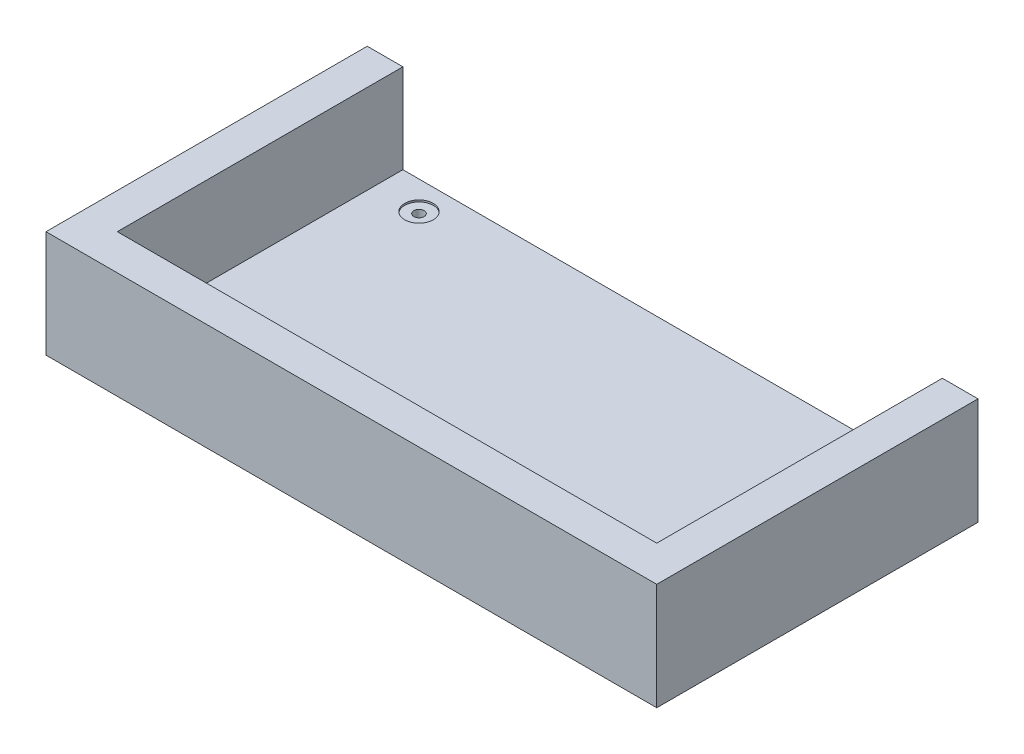
ISO-10303-21;
HEADER;
FILE_DESCRIPTION(('STEP AP214'),'2;1');
FILE_NAME('part.step','',(''),(''),'','','');
FILE_SCHEMA(('AUTOMOTIVE_DESIGN { 1 0 10303 214 1 1 1 1 }'));
ENDSEC;
DATA;
#1=APPLICATION_CONTEXT('core data for automotive mechanical design processes');
#2=APPLICATION_PROTOCOL_DEFINITION('international standard','automotive_design',2000,#1);
#3=PRODUCT_CONTEXT('',#1,'mechanical');
#4=PRODUCT('Part','Part','',(#3));
#5=PRODUCT_RELATED_PRODUCT_CATEGORY('part','',(#4));
#6=PRODUCT_DEFINITION_FORMATION('','',#4);
#7=PRODUCT_DEFINITION_CONTEXT('part definition',#1,'design');
#8=PRODUCT_DEFINITION('design','',#6,#7);
#9=PRODUCT_DEFINITION_SHAPE('','',#8);
#10=(LENGTH_UNIT() NAMED_UNIT(*) SI_UNIT(.MILLI.,.METRE.));
#11=(NAMED_UNIT(*) PLANE_ANGLE_UNIT() SI_UNIT($,.RADIAN.));
#12=(NAMED_UNIT(*) SI_UNIT($,.STERADIAN.) SOLID_ANGLE_UNIT());
#13=UNCERTAINTY_MEASURE_WITH_UNIT(LENGTH_MEASURE(1.E-05),#10,'distance_accuracy_value','');
#14=(GEOMETRIC_REPRESENTATION_CONTEXT(3) GLOBAL_UNCERTAINTY_ASSIGNED_CONTEXT((#13)) GLOBAL_UNIT_ASSIGNED_CONTEXT((#10,
#11,#12)) REPRESENTATION_CONTEXT('',''));
#15=CARTESIAN_POINT('',(0.,0.,0.));
#16=DIRECTION('',(0.,0.,1.));
#17=DIRECTION('',(1.,0.,0.));
#18=AXIS2_PLACEMENT_3D('',#15,#16,#17);
#19=CARTESIAN_POINT('',(-53.6717133956386,5.,-53.3701869158878));
#20=DIRECTION('',(0.,0.,1.));
#21=DIRECTION('',(1.,0.,0.));
#22=AXIS2_PLACEMENT_3D('',#19,#20,#21);
#23=PLANE('',#22);
#24=DIRECTION('',(-1.,0.,0.));
#25=VECTOR('',#24,1.);
#26=CARTESIAN_POINT('',(-53.6717133956386,0.,-53.3701869158878));
#27=LINE('',#26,#25);
#28=CARTESIAN_POINT('',(107.658286604361,0.,-53.3701869158878));
#29=VERTEX_POINT('',#28);
#30=CARTESIAN_POINT('',(-63.6717133956386,0.,-53.3701869158878));
#31=VERTEX_POINT('',#30);
#32=EDGE_CURVE('E120',#29,#31,#27,.T.);
#33=ORIENTED_EDGE('',*,*,#32,.T.);
#34=DIRECTION('',(0.,-1.,0.));
#35=VECTOR('',#34,1.);
#36=CARTESIAN_POINT('',(-63.6717133956386,30.,-53.3701869158878));
#37=LINE('',#36,#35);
#38=CARTESIAN_POINT('',(-63.6717133956386,30.,-53.3701869158878));
#39=VERTEX_POINT('',#38);
#40=EDGE_CURVE('E101',#39,#31,#37,.T.);
#41=ORIENTED_EDGE('',*,*,#40,.F.);
#42=DIRECTION('',(-1.,0.,0.));
#43=VECTOR('',#42,1.);
#44=CARTESIAN_POINT('',(0.,30.,-53.3701869158878));
#45=LINE('',#44,#43);
#46=CARTESIAN_POINT('',(-53.6717133956386,30.,-53.3701869158878));
#47=VERTEX_POINT('',#46);
#48=EDGE_CURVE('E107',#47,#39,#45,.T.);
#49=ORIENTED_EDGE('',*,*,#48,.F.);
#50=DIRECTION('',(0.,-1.,0.));
#51=VECTOR('',#50,1.);
#52=CARTESIAN_POINT('',(-53.6717133956386,30.,-53.3701869158878));
#53=LINE('',#52,#51);
#54=CARTESIAN_POINT('',(-53.6717133956386,5.,-53.3701869158878));
#55=VERTEX_POINT('',#54);
#56=EDGE_CURVE('E185',#47,#55,#53,.T.);
#57=ORIENTED_EDGE('',*,*,#56,.T.);
#58=DIRECTION('',(-1.,0.,0.));
#59=VECTOR('',#58,1.);
#60=CARTESIAN_POINT('',(-53.6717133956386,5.,-53.3701869158878));
#61=LINE('',#60,#59);
#62=CARTESIAN_POINT('',(97.6582866043614,5.,-53.3701869158878));
#63=VERTEX_POINT('',#62);
#64=EDGE_CURVE('E11',#63,#55,#61,.T.);
#65=ORIENTED_EDGE('',*,*,#64,.F.);
#66=DIRECTION('',(0.,-1.,0.));
#67=VECTOR('',#66,1.);
#68=CARTESIAN_POINT('',(97.6582866043614,30.,-53.3701869158878));
#69=LINE('',#68,#67);
#70=CARTESIAN_POINT('',(97.6582866043614,30.,-53.3701869158878));
#71=VERTEX_POINT('',#70);
#72=EDGE_CURVE('E199',#71,#63,#69,.T.);
#73=ORIENTED_EDGE('',*,*,#72,.F.);
#74=DIRECTION('',(1.,0.,0.));
#75=VECTOR('',#74,1.);
#76=CARTESIAN_POINT('',(0.,30.,-53.3701869158878));
#77=LINE('',#76,#75);
#78=CARTESIAN_POINT('',(107.658286604361,30.,-53.3701869158878));
#79=VERTEX_POINT('',#78);
#80=EDGE_CURVE('E176',#71,#79,#77,.T.);
#81=ORIENTED_EDGE('',*,*,#80,.T.);
#82=DIRECTION('',(0.,-1.,0.));
#83=VECTOR('',#82,1.);
#84=CARTESIAN_POINT('',(107.658286604361,30.,-53.3701869158878));
#85=LINE('',#84,#83);
#86=EDGE_CURVE('E202',#79,#29,#85,.T.);
#87=ORIENTED_EDGE('',*,*,#86,.T.);
#88=EDGE_LOOP('',(#33,#41,#49,#57,#65,#73,#81,#87));
#89=FACE_BOUND('',#88,.T.);
#90=ADVANCED_FACE('F35',(#89),#23,.F.);
#91=CARTESIAN_POINT('',(0.,5.,0.));
#92=DIRECTION('',(0.,1.,0.));
#93=DIRECTION('',(0.,0.,1.));
#94=AXIS2_PLACEMENT_3D('',#91,#92,#93);
#95=PLANE('',#94);
#96=CARTESIAN_POINT('',(85.7004089556943,5.,16.2566118993325));
#97=DIRECTION('',(0.,1.,0.));
#98=DIRECTION('',(0.,0.,1.));
#99=AXIS2_PLACEMENT_3D('',#96,#97,#98);
#100=CIRCLE('',#99,4.);
#101=CARTESIAN_POINT('',(85.7004089556943,5.,20.2566118993325));
#102=VERTEX_POINT('',#101);
#103=EDGE_CURVE('E301',#102,#102,#100,.T.);
#104=ORIENTED_EDGE('',*,*,#103,.F.);
#105=EDGE_LOOP('',(#104));
#106=FACE_BOUND('',#105,.T.);
#107=CARTESIAN_POINT('',(-41.247040950059,5.,16.3367924297844));
#108=DIRECTION('',(0.,1.,0.));
#109=DIRECTION('',(0.,0.,1.));
#110=AXIS2_PLACEMENT_3D('',#107,#108,#109);
#111=CIRCLE('',#110,4.);
#112=CARTESIAN_POINT('',(-41.247040950059,5.,20.3367924297844));
#113=VERTEX_POINT('',#112);
#114=EDGE_CURVE('E157',#113,#113,#111,.T.);
#115=ORIENTED_EDGE('',*,*,#114,.F.);
#116=EDGE_LOOP('',(#115));
#117=FACE_BOUND('',#116,.T.);
#118=CARTESIAN_POINT('',(-41.247040950059,5.,-45.4632364629279));
#119=DIRECTION('',(0.,1.,0.));
#120=DIRECTION('',(0.,0.,1.));
#121=AXIS2_PLACEMENT_3D('',#118,#119,#120);
#122=CIRCLE('',#121,4.);
#123=CARTESIAN_POINT('',(-41.247040950059,5.,-41.4632364629279));
#124=VERTEX_POINT('',#123);
#125=EDGE_CURVE('E144',#124,#124,#122,.T.);
#126=ORIENTED_EDGE('',*,*,#125,.F.);
#127=EDGE_LOOP('',(#126));
#128=FACE_BOUND('',#127,.T.);
#129=CARTESIAN_POINT('',(86.0699895869456,5.,-45.4632364629279));
#130=DIRECTION('',(0.,1.,0.));
#131=DIRECTION('',(0.,0.,1.));
#132=AXIS2_PLACEMENT_3D('',#129,#130,#131);
#133=CIRCLE('',#132,4.);
#134=CARTESIAN_POINT('',(86.0699895869456,5.,-41.4632364629279));
#135=VERTEX_POINT('',#134);
#136=EDGE_CURVE('E140',#135,#135,#133,.T.);
#137=ORIENTED_EDGE('',*,*,#136,.F.);
#138=EDGE_LOOP('',(#137));
#139=FACE_BOUND('',#138,.T.);
#140=DIRECTION('',(0.,0.,1.));
#141=VECTOR('',#140,1.);
#142=CARTESIAN_POINT('',(-53.6717133956386,5.,-53.3701869158878));
#143=LINE('',#142,#141);
#144=CARTESIAN_POINT('',(-53.6717133956386,5.,26.7498130841122));
#145=VERTEX_POINT('',#144);
#146=EDGE_CURVE('E123',#55,#145,#143,.T.);
#147=ORIENTED_EDGE('',*,*,#146,.T.);
#148=DIRECTION('',(1.,0.,0.));
#149=VECTOR('',#148,1.);
#150=CARTESIAN_POINT('',(-53.6717133956386,5.,26.7498130841122));
#151=LINE('',#150,#149);
#152=CARTESIAN_POINT('',(97.6582866043614,5.,26.7498130841122));
#153=VERTEX_POINT('',#152);
#154=EDGE_CURVE('E130',#145,#153,#151,.T.);
#155=ORIENTED_EDGE('',*,*,#154,.T.);
#156=DIRECTION('',(0.,0.,-1.));
#157=VECTOR('',#156,1.);
#158=CARTESIAN_POINT('',(97.6582866043614,5.,-53.3701869158878));
#159=LINE('',#158,#157);
#160=EDGE_CURVE('E43',#153,#63,#159,.T.);
#161=ORIENTED_EDGE('',*,*,#160,.T.);
#162=ORIENTED_EDGE('',*,*,#64,.T.);
#163=EDGE_LOOP('',(#147,#155,#161,#162));
#164=FACE_BOUND('',#163,.T.);
#165=ADVANCED_FACE('F222',(#106,#117,#128,#139,#164),#95,.T.);
#166=CARTESIAN_POINT('',(0.,0.,0.));
#167=DIRECTION('',(0.,1.,0.));
#168=DIRECTION('',(0.,0.,1.));
#169=AXIS2_PLACEMENT_3D('',#166,#167,#168);
#170=PLANE('',#169);
#171=CARTESIAN_POINT('',(85.7004089556943,0.,16.2566118993325));
#172=DIRECTION('',(0.,1.,0.));
#173=DIRECTION('',(0.,0.,1.));
#174=AXIS2_PLACEMENT_3D('',#171,#172,#173);
#175=CIRCLE('',#174,1.44999999999999);
#176=CARTESIAN_POINT('',(85.7004089556943,0.,17.7066118993325));
#177=VERTEX_POINT('',#176);
#178=EDGE_CURVE('E38',#177,#177,#175,.T.);
#179=ORIENTED_EDGE('',*,*,#178,.T.);
#180=EDGE_LOOP('',(#179));
#181=FACE_BOUND('',#180,.T.);
#182=CARTESIAN_POINT('',(-41.247040950059,0.,16.3367924297844));
#183=DIRECTION('',(0.,1.,0.));
#184=DIRECTION('',(0.,0.,1.));
#185=AXIS2_PLACEMENT_3D('',#182,#183,#184);
#186=CIRCLE('',#185,1.45);
#187=CARTESIAN_POINT('',(-41.247040950059,0.,17.7867924297844));
#188=VERTEX_POINT('',#187);
#189=EDGE_CURVE('E142',#188,#188,#186,.T.);
#190=ORIENTED_EDGE('',*,*,#189,.T.);
#191=EDGE_LOOP('',(#190));
#192=FACE_BOUND('',#191,.T.);
#193=CARTESIAN_POINT('',(-41.247040950059,0.,-45.4632364629279));
#194=DIRECTION('',(0.,1.,0.));
#195=DIRECTION('',(0.,0.,1.));
#196=AXIS2_PLACEMENT_3D('',#193,#194,#195);
#197=CIRCLE('',#196,1.45);
#198=CARTESIAN_POINT('',(-41.247040950059,0.,-44.0132364629279));
#199=VERTEX_POINT('',#198);
#200=EDGE_CURVE('E138',#199,#199,#197,.T.);
#201=ORIENTED_EDGE('',*,*,#200,.T.);
#202=EDGE_LOOP('',(#201));
#203=FACE_BOUND('',#202,.T.);
#204=CARTESIAN_POINT('',(86.0699895869456,0.,-45.4632364629279));
#205=DIRECTION('',(0.,1.,0.));
#206=DIRECTION('',(0.,0.,1.));
#207=AXIS2_PLACEMENT_3D('',#204,#205,#206);
#208=CIRCLE('',#207,1.44999999999999);
#209=CARTESIAN_POINT('',(86.0699895869456,0.,-44.0132364629279));
#210=VERTEX_POINT('',#209);
#211=EDGE_CURVE('E133',#210,#210,#208,.T.);
#212=ORIENTED_EDGE('',*,*,#211,.T.);
#213=EDGE_LOOP('',(#212));
#214=FACE_BOUND('',#213,.T.);
#215=ORIENTED_EDGE('',*,*,#32,.F.);
#216=DIRECTION('',(0.,0.,1.));
#217=VECTOR('',#216,1.);
#218=CARTESIAN_POINT('',(107.658286604361,0.,0.));
#219=LINE('',#218,#217);
#220=CARTESIAN_POINT('',(107.658286604361,0.,36.7498130841122));
#221=VERTEX_POINT('',#220);
#222=EDGE_CURVE('E117',#29,#221,#219,.T.);
#223=ORIENTED_EDGE('',*,*,#222,.T.);
#224=DIRECTION('',(-1.,0.,0.));
#225=VECTOR('',#224,1.);
#226=CARTESIAN_POINT('',(0.,0.,36.7498130841122));
#227=LINE('',#226,#225);
#228=CARTESIAN_POINT('',(-63.6717133956386,0.,36.7498130841122));
#229=VERTEX_POINT('',#228);
#230=EDGE_CURVE('E187',#221,#229,#227,.T.);
#231=ORIENTED_EDGE('',*,*,#230,.T.);
#232=DIRECTION('',(0.,0.,1.));
#233=VECTOR('',#232,1.);
#234=CARTESIAN_POINT('',(-63.6717133956386,0.,0.));
#235=LINE('',#234,#233);
#236=EDGE_CURVE('E136',#31,#229,#235,.T.);
#237=ORIENTED_EDGE('',*,*,#236,.F.);
#238=EDGE_LOOP('',(#215,#223,#231,#237));
#239=FACE_BOUND('',#238,.T.);
#240=ADVANCED_FACE('F211',(#181,#192,#203,#214,#239),#170,.F.);
#241=CARTESIAN_POINT('',(-63.6717133956386,30.,0.));
#242=DIRECTION('',(1.,0.,0.));
#243=DIRECTION('',(0.,0.,-1.));
#244=AXIS2_PLACEMENT_3D('',#241,#242,#243);
#245=PLANE('',#244);
#246=ORIENTED_EDGE('',*,*,#236,.T.);
#247=DIRECTION('',(0.,-1.,0.));
#248=VECTOR('',#247,1.);
#249=CARTESIAN_POINT('',(-63.6717133956386,30.,36.7498130841122));
#250=LINE('',#249,#248);
#251=CARTESIAN_POINT('',(-63.6717133956386,30.,36.7498130841122));
#252=VERTEX_POINT('',#251);
#253=EDGE_CURVE('E102',#252,#229,#250,.T.);
#254=ORIENTED_EDGE('',*,*,#253,.F.);
#255=DIRECTION('',(0.,0.,1.));
#256=VECTOR('',#255,1.);
#257=CARTESIAN_POINT('',(-63.6717133956386,30.,0.));
#258=LINE('',#257,#256);
#259=EDGE_CURVE('E96',#39,#252,#258,.T.);
#260=ORIENTED_EDGE('',*,*,#259,.F.);
#261=ORIENTED_EDGE('',*,*,#40,.T.);
#262=EDGE_LOOP('',(#246,#254,#260,#261));
#263=FACE_BOUND('',#262,.T.);
#264=ADVANCED_FACE('F99',(#263),#245,.F.);
#265=CARTESIAN_POINT('',(0.,30.,36.7498130841122));
#266=DIRECTION('',(0.,0.,1.));
#267=DIRECTION('',(1.,0.,0.));
#268=AXIS2_PLACEMENT_3D('',#265,#266,#267);
#269=PLANE('',#268);
#270=ORIENTED_EDGE('',*,*,#230,.F.);
#271=DIRECTION('',(0.,-1.,0.));
#272=VECTOR('',#271,1.);
#273=CARTESIAN_POINT('',(107.658286604361,30.,36.7498130841122));
#274=LINE('',#273,#272);
#275=CARTESIAN_POINT('',(107.658286604361,30.,36.7498130841122));
#276=VERTEX_POINT('',#275);
#277=EDGE_CURVE('E125',#276,#221,#274,.T.);
#278=ORIENTED_EDGE('',*,*,#277,.F.);
#279=DIRECTION('',(-1.,0.,0.));
#280=VECTOR('',#279,1.);
#281=CARTESIAN_POINT('',(0.,30.,36.7498130841122));
#282=LINE('',#281,#280);
#283=EDGE_CURVE('E106',#276,#252,#282,.T.);
#284=ORIENTED_EDGE('',*,*,#283,.T.);
#285=ORIENTED_EDGE('',*,*,#253,.T.);
#286=EDGE_LOOP('',(#270,#278,#284,#285));
#287=FACE_BOUND('',#286,.T.);
#288=ADVANCED_FACE('F209',(#287),#269,.T.);
#289=CARTESIAN_POINT('',(107.658286604361,30.,0.));
#290=DIRECTION('',(1.,0.,0.));
#291=DIRECTION('',(0.,0.,-1.));
#292=AXIS2_PLACEMENT_3D('',#289,#290,#291);
#293=PLANE('',#292);
#294=ORIENTED_EDGE('',*,*,#222,.F.);
#295=ORIENTED_EDGE('',*,*,#86,.F.);
#296=DIRECTION('',(0.,0.,1.));
#297=VECTOR('',#296,1.);
#298=CARTESIAN_POINT('',(107.658286604361,30.,0.));
#299=LINE('',#298,#297);
#300=EDGE_CURVE('E173',#79,#276,#299,.T.);
#301=ORIENTED_EDGE('',*,*,#300,.T.);
#302=ORIENTED_EDGE('',*,*,#277,.T.);
#303=EDGE_LOOP('',(#294,#295,#301,#302));
#304=FACE_BOUND('',#303,.T.);
#305=ADVANCED_FACE('F206',(#304),#293,.T.);
#306=CARTESIAN_POINT('',(97.6582866043614,30.,0.));
#307=DIRECTION('',(1.,0.,0.));
#308=DIRECTION('',(0.,0.,-1.));
#309=AXIS2_PLACEMENT_3D('',#306,#307,#308);
#310=PLANE('',#309);
#311=ORIENTED_EDGE('',*,*,#160,.F.);
#312=DIRECTION('',(0.,-1.,0.));
#313=VECTOR('',#312,1.);
#314=CARTESIAN_POINT('',(97.6582866043614,30.,26.7498130841122));
#315=LINE('',#314,#313);
#316=CARTESIAN_POINT('',(97.6582866043614,30.,26.7498130841122));
#317=VERTEX_POINT('',#316);
#318=EDGE_CURVE('E196',#317,#153,#315,.T.);
#319=ORIENTED_EDGE('',*,*,#318,.F.);
#320=DIRECTION('',(0.,0.,1.));
#321=VECTOR('',#320,1.);
#322=CARTESIAN_POINT('',(97.6582866043614,30.,0.));
#323=LINE('',#322,#321);
#324=EDGE_CURVE('E179',#71,#317,#323,.T.);
#325=ORIENTED_EDGE('',*,*,#324,.F.);
#326=ORIENTED_EDGE('',*,*,#72,.T.);
#327=EDGE_LOOP('',(#311,#319,#325,#326));
#328=FACE_BOUND('',#327,.T.);
#329=ADVANCED_FACE('F216',(#328),#310,.F.);
#330=CARTESIAN_POINT('',(0.,30.,26.7498130841122));
#331=DIRECTION('',(0.,0.,-1.));
#332=DIRECTION('',(-1.,0.,0.));
#333=AXIS2_PLACEMENT_3D('',#330,#331,#332);
#334=PLANE('',#333);
#335=ORIENTED_EDGE('',*,*,#318,.T.);
#336=ORIENTED_EDGE('',*,*,#154,.F.);
#337=DIRECTION('',(0.,-1.,0.));
#338=VECTOR('',#337,1.);
#339=CARTESIAN_POINT('',(-53.6717133956386,30.,26.7498130841122));
#340=LINE('',#339,#338);
#341=CARTESIAN_POINT('',(-53.6717133956386,30.,26.7498130841122));
#342=VERTEX_POINT('',#341);
#343=EDGE_CURVE('E193',#342,#145,#340,.T.);
#344=ORIENTED_EDGE('',*,*,#343,.F.);
#345=DIRECTION('',(1.,0.,0.));
#346=VECTOR('',#345,1.);
#347=CARTESIAN_POINT('',(0.,30.,26.7498130841122));
#348=LINE('',#347,#346);
#349=EDGE_CURVE('E181',#342,#317,#348,.T.);
#350=ORIENTED_EDGE('',*,*,#349,.T.);
#351=EDGE_LOOP('',(#335,#336,#344,#350));
#352=FACE_BOUND('',#351,.T.);
#353=ADVANCED_FACE('F219',(#352),#334,.T.);
#354=CARTESIAN_POINT('',(-53.6717133956386,30.,0.));
#355=DIRECTION('',(1.,0.,0.));
#356=DIRECTION('',(0.,0.,-1.));
#357=AXIS2_PLACEMENT_3D('',#354,#355,#356);
#358=PLANE('',#357);
#359=ORIENTED_EDGE('',*,*,#343,.T.);
#360=ORIENTED_EDGE('',*,*,#146,.F.);
#361=ORIENTED_EDGE('',*,*,#56,.F.);
#362=DIRECTION('',(0.,0.,1.));
#363=VECTOR('',#362,1.);
#364=CARTESIAN_POINT('',(-53.6717133956386,30.,0.));
#365=LINE('',#364,#363);
#366=EDGE_CURVE('E114',#47,#342,#365,.T.);
#367=ORIENTED_EDGE('',*,*,#366,.T.);
#368=EDGE_LOOP('',(#359,#360,#361,#367));
#369=FACE_BOUND('',#368,.T.);
#370=ADVANCED_FACE('F221',(#369),#358,.T.);
#371=CARTESIAN_POINT('',(0.,30.,0.));
#372=DIRECTION('',(0.,1.,0.));
#373=DIRECTION('',(0.,0.,1.));
#374=AXIS2_PLACEMENT_3D('',#371,#372,#373);
#375=PLANE('',#374);
#376=ORIENTED_EDGE('',*,*,#48,.T.);
#377=ORIENTED_EDGE('',*,*,#259,.T.);
#378=ORIENTED_EDGE('',*,*,#283,.F.);
#379=ORIENTED_EDGE('',*,*,#300,.F.);
#380=ORIENTED_EDGE('',*,*,#80,.F.);
#381=ORIENTED_EDGE('',*,*,#324,.T.);
#382=ORIENTED_EDGE('',*,*,#349,.F.);
#383=ORIENTED_EDGE('',*,*,#366,.F.);
#384=EDGE_LOOP('',(#376,#377,#378,#379,#380,#381,#382,#383));
#385=FACE_BOUND('',#384,.T.);
#386=ADVANCED_FACE('F111',(#385),#375,.T.);
#387=CARTESIAN_POINT('',(86.0699895869456,5.,-45.4632364629279));
#388=DIRECTION('',(0.,1.,0.));
#389=DIRECTION('',(0.,0.,1.));
#390=AXIS2_PLACEMENT_3D('',#387,#388,#389);
#391=CYLINDRICAL_SURFACE('',#390,1.44999999999999);
#392=CARTESIAN_POINT('',(86.0699895869456,4.5,-45.4632364629279));
#393=DIRECTION('',(0.,1.,0.));
#394=DIRECTION('',(0.,0.,1.));
#395=AXIS2_PLACEMENT_3D('',#392,#393,#394);
#396=CIRCLE('',#395,1.44999999999999);
#397=CARTESIAN_POINT('',(86.0699895869456,4.5,-44.0132364629279));
#398=VERTEX_POINT('',#397);
#399=EDGE_CURVE('E137',#398,#398,#396,.T.);
#400=ORIENTED_EDGE('',*,*,#399,.T.);
#401=EDGE_LOOP('',(#400));
#402=FACE_BOUND('',#401,.T.);
#403=ORIENTED_EDGE('',*,*,#211,.F.);
#404=EDGE_LOOP('',(#403));
#405=FACE_BOUND('',#404,.T.);
#406=ADVANCED_FACE('F248',(#402,#405),#391,.F.);
#407=CARTESIAN_POINT('',(87.5199895869456,4.5,-45.4632364629279));
#408=DIRECTION('',(0.,-1.,0.));
#409=DIRECTION('',(0.,0.,-1.));
#410=AXIS2_PLACEMENT_3D('',#407,#408,#409);
#411=PLANE('',#410);
#412=ORIENTED_EDGE('',*,*,#399,.F.);
#413=EDGE_LOOP('',(#412));
#414=FACE_BOUND('',#413,.T.);
#415=CARTESIAN_POINT('',(86.0699895869456,4.5,-45.4632364629279));
#416=DIRECTION('',(0.,1.,0.));
#417=DIRECTION('',(0.,0.,1.));
#418=AXIS2_PLACEMENT_3D('',#415,#416,#417);
#419=CIRCLE('',#418,4.);
#420=CARTESIAN_POINT('',(86.0699895869456,4.5,-41.4632364629279));
#421=VERTEX_POINT('',#420);
#422=EDGE_CURVE('E167',#421,#421,#419,.T.);
#423=ORIENTED_EDGE('',*,*,#422,.T.);
#424=EDGE_LOOP('',(#423));
#425=FACE_BOUND('',#424,.T.);
#426=ADVANCED_FACE('F251',(#414,#425),#411,.F.);
#427=CARTESIAN_POINT('',(86.0699895869456,5.,-45.4632364629279));
#428=DIRECTION('',(0.,1.,0.));
#429=DIRECTION('',(0.,0.,1.));
#430=AXIS2_PLACEMENT_3D('',#427,#428,#429);
#431=CYLINDRICAL_SURFACE('',#430,4.);
#432=ORIENTED_EDGE('',*,*,#422,.F.);
#433=EDGE_LOOP('',(#432));
#434=FACE_BOUND('',#433,.T.);
#435=ORIENTED_EDGE('',*,*,#136,.T.);
#436=EDGE_LOOP('',(#435));
#437=FACE_BOUND('',#436,.T.);
#438=ADVANCED_FACE('F255',(#434,#437),#431,.F.);
#439=CARTESIAN_POINT('',(-41.247040950059,5.,-45.4632364629279));
#440=DIRECTION('',(0.,1.,0.));
#441=DIRECTION('',(0.,0.,1.));
#442=AXIS2_PLACEMENT_3D('',#439,#440,#441);
#443=CYLINDRICAL_SURFACE('',#442,1.45);
#444=CARTESIAN_POINT('',(-41.247040950059,4.5,-45.4632364629279));
#445=DIRECTION('',(0.,1.,0.));
#446=DIRECTION('',(0.,0.,1.));
#447=AXIS2_PLACEMENT_3D('',#444,#445,#446);
#448=CIRCLE('',#447,1.45);
#449=CARTESIAN_POINT('',(-41.247040950059,4.5,-44.0132364629279));
#450=VERTEX_POINT('',#449);
#451=EDGE_CURVE('E141',#450,#450,#448,.T.);
#452=ORIENTED_EDGE('',*,*,#451,.T.);
#453=EDGE_LOOP('',(#452));
#454=FACE_BOUND('',#453,.T.);
#455=ORIENTED_EDGE('',*,*,#200,.F.);
#456=EDGE_LOOP('',(#455));
#457=FACE_BOUND('',#456,.T.);
#458=ADVANCED_FACE('F259',(#454,#457),#443,.F.);
#459=CARTESIAN_POINT('',(-39.797040950059,4.5,-45.4632364629279));
#460=DIRECTION('',(0.,-1.,0.));
#461=DIRECTION('',(0.,0.,-1.));
#462=AXIS2_PLACEMENT_3D('',#459,#460,#461);
#463=PLANE('',#462);
#464=ORIENTED_EDGE('',*,*,#451,.F.);
#465=EDGE_LOOP('',(#464));
#466=FACE_BOUND('',#465,.T.);
#467=CARTESIAN_POINT('',(-41.247040950059,4.5,-45.4632364629279));
#468=DIRECTION('',(0.,1.,0.));
#469=DIRECTION('',(0.,0.,1.));
#470=AXIS2_PLACEMENT_3D('',#467,#468,#469);
#471=CIRCLE('',#470,4.);
#472=CARTESIAN_POINT('',(-41.247040950059,4.5,-41.4632364629279));
#473=VERTEX_POINT('',#472);
#474=EDGE_CURVE('E149',#473,#473,#471,.T.);
#475=ORIENTED_EDGE('',*,*,#474,.T.);
#476=EDGE_LOOP('',(#475));
#477=FACE_BOUND('',#476,.T.);
#478=ADVANCED_FACE('F263',(#466,#477),#463,.F.);
#479=CARTESIAN_POINT('',(-41.247040950059,5.,-45.4632364629279));
#480=DIRECTION('',(0.,1.,0.));
#481=DIRECTION('',(0.,0.,1.));
#482=AXIS2_PLACEMENT_3D('',#479,#480,#481);
#483=CYLINDRICAL_SURFACE('',#482,4.);
#484=ORIENTED_EDGE('',*,*,#474,.F.);
#485=EDGE_LOOP('',(#484));
#486=FACE_BOUND('',#485,.T.);
#487=ORIENTED_EDGE('',*,*,#125,.T.);
#488=EDGE_LOOP('',(#487));
#489=FACE_BOUND('',#488,.T.);
#490=ADVANCED_FACE('F267',(#486,#489),#483,.F.);
#491=CARTESIAN_POINT('',(-41.247040950059,5.,16.3367924297844));
#492=DIRECTION('',(0.,1.,0.));
#493=DIRECTION('',(0.,0.,1.));
#494=AXIS2_PLACEMENT_3D('',#491,#492,#493);
#495=CYLINDRICAL_SURFACE('',#494,1.45);
#496=CARTESIAN_POINT('',(-41.247040950059,4.5,16.3367924297844));
#497=DIRECTION('',(0.,1.,0.));
#498=DIRECTION('',(0.,0.,1.));
#499=AXIS2_PLACEMENT_3D('',#496,#497,#498);
#500=CIRCLE('',#499,1.45);
#501=CARTESIAN_POINT('',(-41.247040950059,4.5,17.7867924297844));
#502=VERTEX_POINT('',#501);
#503=EDGE_CURVE('E145',#502,#502,#500,.T.);
#504=ORIENTED_EDGE('',*,*,#503,.T.);
#505=EDGE_LOOP('',(#504));
#506=FACE_BOUND('',#505,.T.);
#507=ORIENTED_EDGE('',*,*,#189,.F.);
#508=EDGE_LOOP('',(#507));
#509=FACE_BOUND('',#508,.T.);
#510=ADVANCED_FACE('F271',(#506,#509),#495,.F.);
#511=CARTESIAN_POINT('',(-39.797040950059,4.5,16.3367924297844));
#512=DIRECTION('',(0.,-1.,0.));
#513=DIRECTION('',(0.,0.,-1.));
#514=AXIS2_PLACEMENT_3D('',#511,#512,#513);
#515=PLANE('',#514);
#516=ORIENTED_EDGE('',*,*,#503,.F.);
#517=EDGE_LOOP('',(#516));
#518=FACE_BOUND('',#517,.T.);
#519=CARTESIAN_POINT('',(-41.247040950059,4.5,16.3367924297844));
#520=DIRECTION('',(0.,1.,0.));
#521=DIRECTION('',(0.,0.,1.));
#522=AXIS2_PLACEMENT_3D('',#519,#520,#521);
#523=CIRCLE('',#522,4.);
#524=CARTESIAN_POINT('',(-41.247040950059,4.5,20.3367924297844));
#525=VERTEX_POINT('',#524);
#526=EDGE_CURVE('E152',#525,#525,#523,.T.);
#527=ORIENTED_EDGE('',*,*,#526,.T.);
#528=EDGE_LOOP('',(#527));
#529=FACE_BOUND('',#528,.T.);
#530=ADVANCED_FACE('F275',(#518,#529),#515,.F.);
#531=CARTESIAN_POINT('',(-41.247040950059,5.,16.3367924297844));
#532=DIRECTION('',(0.,1.,0.));
#533=DIRECTION('',(0.,0.,1.));
#534=AXIS2_PLACEMENT_3D('',#531,#532,#533);
#535=CYLINDRICAL_SURFACE('',#534,4.);
#536=ORIENTED_EDGE('',*,*,#526,.F.);
#537=EDGE_LOOP('',(#536));
#538=FACE_BOUND('',#537,.T.);
#539=ORIENTED_EDGE('',*,*,#114,.T.);
#540=EDGE_LOOP('',(#539));
#541=FACE_BOUND('',#540,.T.);
#542=ADVANCED_FACE('F278',(#538,#541),#535,.F.);
#543=CARTESIAN_POINT('',(85.7004089556943,5.,16.2566118993325));
#544=DIRECTION('',(0.,1.,0.));
#545=DIRECTION('',(0.,0.,1.));
#546=AXIS2_PLACEMENT_3D('',#543,#544,#545);
#547=CYLINDRICAL_SURFACE('',#546,1.44999999999999);
#548=CARTESIAN_POINT('',(85.7004089556943,4.5,16.2566118993325));
#549=DIRECTION('',(0.,1.,0.));
#550=DIRECTION('',(0.,0.,1.));
#551=AXIS2_PLACEMENT_3D('',#548,#549,#550);
#552=CIRCLE('',#551,1.44999999999999);
#553=CARTESIAN_POINT('',(85.7004089556943,4.5,17.7066118993325));
#554=VERTEX_POINT('',#553);
#555=EDGE_CURVE('E303',#554,#554,#552,.T.);
#556=ORIENTED_EDGE('',*,*,#555,.T.);
#557=EDGE_LOOP('',(#556));
#558=FACE_BOUND('',#557,.T.);
#559=ORIENTED_EDGE('',*,*,#178,.F.);
#560=EDGE_LOOP('',(#559));
#561=FACE_BOUND('',#560,.T.);
#562=ADVANCED_FACE('F282',(#558,#561),#547,.F.);
#563=CARTESIAN_POINT('',(87.1504089556943,4.5,16.2566118993325));
#564=DIRECTION('',(0.,-1.,0.));
#565=DIRECTION('',(0.,0.,-1.));
#566=AXIS2_PLACEMENT_3D('',#563,#564,#565);
#567=PLANE('',#566);
#568=ORIENTED_EDGE('',*,*,#555,.F.);
#569=EDGE_LOOP('',(#568));
#570=FACE_BOUND('',#569,.T.);
#571=CARTESIAN_POINT('',(85.7004089556943,4.5,16.2566118993325));
#572=DIRECTION('',(0.,1.,0.));
#573=DIRECTION('',(0.,0.,1.));
#574=AXIS2_PLACEMENT_3D('',#571,#572,#573);
#575=CIRCLE('',#574,4.);
#576=CARTESIAN_POINT('',(85.7004089556943,4.5,20.2566118993325));
#577=VERTEX_POINT('',#576);
#578=EDGE_CURVE('E299',#577,#577,#575,.T.);
#579=ORIENTED_EDGE('',*,*,#578,.T.);
#580=EDGE_LOOP('',(#579));
#581=FACE_BOUND('',#580,.T.);
#582=ADVANCED_FACE('F286',(#570,#581),#567,.F.);
#583=CARTESIAN_POINT('',(85.7004089556943,5.,16.2566118993325));
#584=DIRECTION('',(0.,1.,0.));
#585=DIRECTION('',(0.,0.,1.));
#586=AXIS2_PLACEMENT_3D('',#583,#584,#585);
#587=CYLINDRICAL_SURFACE('',#586,4.);
#588=ORIENTED_EDGE('',*,*,#578,.F.);
#589=EDGE_LOOP('',(#588));
#590=FACE_BOUND('',#589,.T.);
#591=ORIENTED_EDGE('',*,*,#103,.T.);
#592=EDGE_LOOP('',(#591));
#593=FACE_BOUND('',#592,.T.);
#594=ADVANCED_FACE('F290',(#590,#593),#587,.F.);
#595=CLOSED_SHELL('',(#90,#165,#240,#264,#288,#305,#329,#353,#370,#386,#406,#426,#438,#458,#478,
#490,#510,#530,#542,#562,#582,#594));
#596=MANIFOLD_SOLID_BREP('B2',#595);
#597=ADVANCED_BREP_SHAPE_REPRESENTATION('',(#18,#596),#14);
#598=SHAPE_DEFINITION_REPRESENTATION(#9,#597);
ENDSEC;
END-ISO-10303-21;
